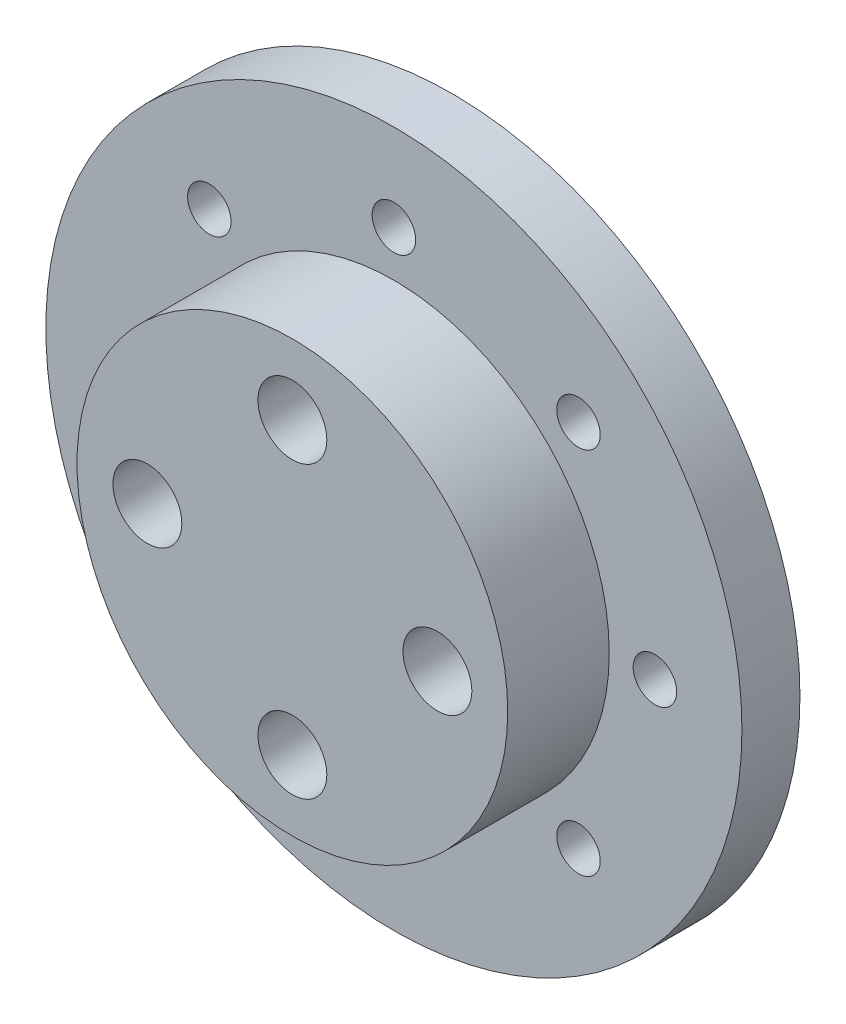
ISO-10303-21;
HEADER;
FILE_DESCRIPTION(('STEP AP214'),'2;1');
FILE_NAME('part.step','',(''),(''),'','','');
FILE_SCHEMA(('AUTOMOTIVE_DESIGN { 1 0 10303 214 1 1 1 1 }'));
ENDSEC;
DATA;
#1=APPLICATION_CONTEXT('core data for automotive mechanical design processes');
#2=APPLICATION_PROTOCOL_DEFINITION('international standard','automotive_design',2000,#1);
#3=PRODUCT_CONTEXT('',#1,'mechanical');
#4=PRODUCT('Part','Part','',(#3));
#5=PRODUCT_RELATED_PRODUCT_CATEGORY('part','',(#4));
#6=PRODUCT_DEFINITION_FORMATION('','',#4);
#7=PRODUCT_DEFINITION_CONTEXT('part definition',#1,'design');
#8=PRODUCT_DEFINITION('design','',#6,#7);
#9=PRODUCT_DEFINITION_SHAPE('','',#8);
#10=(LENGTH_UNIT() NAMED_UNIT(*) SI_UNIT(.MILLI.,.METRE.));
#11=(NAMED_UNIT(*) PLANE_ANGLE_UNIT() SI_UNIT($,.RADIAN.));
#12=(NAMED_UNIT(*) SI_UNIT($,.STERADIAN.) SOLID_ANGLE_UNIT());
#13=UNCERTAINTY_MEASURE_WITH_UNIT(LENGTH_MEASURE(1.E-05),#10,'distance_accuracy_value','');
#14=(GEOMETRIC_REPRESENTATION_CONTEXT(3) GLOBAL_UNCERTAINTY_ASSIGNED_CONTEXT((#13)) GLOBAL_UNIT_ASSIGNED_CONTEXT((#10,
#11,#12)) REPRESENTATION_CONTEXT('',''));
#15=CARTESIAN_POINT('',(0.,0.,0.));
#16=DIRECTION('',(0.,0.,1.));
#17=DIRECTION('',(1.,0.,0.));
#18=AXIS2_PLACEMENT_3D('',#15,#16,#17);
#19=CARTESIAN_POINT('',(0.,0.,4.));
#20=DIRECTION('',(0.,0.,1.));
#21=DIRECTION('',(1.,0.,0.));
#22=AXIS2_PLACEMENT_3D('',#19,#20,#21);
#23=PLANE('',#22);
#24=CARTESIAN_POINT('',(0.,0.,4.));
#25=DIRECTION('',(0.,0.,1.));
#26=DIRECTION('',(1.,0.,0.));
#27=AXIS2_PLACEMENT_3D('',#24,#25,#26);
#28=CIRCLE('',#27,14.85);
#29=CARTESIAN_POINT('',(14.85,0.,4.));
#30=VERTEX_POINT('',#29);
#31=EDGE_CURVE('E106',#30,#30,#28,.T.);
#32=ORIENTED_EDGE('',*,*,#31,.F.);
#33=EDGE_LOOP('',(#32));
#34=FACE_BOUND('',#33,.T.);
#35=CARTESIAN_POINT('',(-18.,1.88539992297529E-13,4.));
#36=DIRECTION('',(0.,0.,1.));
#37=DIRECTION('',(1.,0.,0.));
#38=AXIS2_PLACEMENT_3D('',#35,#36,#37);
#39=CIRCLE('',#38,1.5);
#40=CARTESIAN_POINT('',(-16.5,1.88539992297529E-13,4.));
#41=VERTEX_POINT('',#40);
#42=EDGE_CURVE('E88',#41,#41,#39,.T.);
#43=ORIENTED_EDGE('',*,*,#42,.F.);
#44=EDGE_LOOP('',(#43));
#45=FACE_BOUND('',#44,.T.);
#46=CARTESIAN_POINT('',(-1.25693328198353E-13,-18.,4.));
#47=DIRECTION('',(0.,0.,1.));
#48=DIRECTION('',(1.,0.,0.));
#49=AXIS2_PLACEMENT_3D('',#46,#47,#48);
#50=CIRCLE('',#49,1.5);
#51=CARTESIAN_POINT('',(1.49999999999987,-18.,4.));
#52=VERTEX_POINT('',#51);
#53=EDGE_CURVE('E76',#52,#52,#50,.T.);
#54=ORIENTED_EDGE('',*,*,#53,.F.);
#55=EDGE_LOOP('',(#54));
#56=FACE_BOUND('',#55,.T.);
#57=CARTESIAN_POINT('',(18.,0.,4.));
#58=DIRECTION('',(0.,0.,1.));
#59=DIRECTION('',(1.,0.,0.));
#60=AXIS2_PLACEMENT_3D('',#57,#58,#59);
#61=CIRCLE('',#60,1.5);
#62=CARTESIAN_POINT('',(19.5,0.,4.));
#63=VERTEX_POINT('',#62);
#64=EDGE_CURVE('E64',#63,#63,#61,.T.);
#65=ORIENTED_EDGE('',*,*,#64,.F.);
#66=EDGE_LOOP('',(#65));
#67=FACE_BOUND('',#66,.T.);
#68=CARTESIAN_POINT('',(0.,0.,4.));
#69=DIRECTION('',(0.,0.,1.));
#70=DIRECTION('',(1.,0.,0.));
#71=AXIS2_PLACEMENT_3D('',#68,#69,#70);
#72=CIRCLE('',#71,24.);
#73=CARTESIAN_POINT('',(24.,0.,4.));
#74=VERTEX_POINT('',#73);
#75=EDGE_CURVE('E10',#74,#74,#72,.T.);
#76=ORIENTED_EDGE('',*,*,#75,.T.);
#77=EDGE_LOOP('',(#76));
#78=FACE_BOUND('',#77,.T.);
#79=CARTESIAN_POINT('',(0.,18.,4.));
#80=DIRECTION('',(0.,0.,1.));
#81=DIRECTION('',(1.,0.,0.));
#82=AXIS2_PLACEMENT_3D('',#79,#80,#81);
#83=CIRCLE('',#82,1.5);
#84=CARTESIAN_POINT('',(1.5,18.,4.));
#85=VERTEX_POINT('',#84);
#86=EDGE_CURVE('E50',#85,#85,#83,.T.);
#87=ORIENTED_EDGE('',*,*,#86,.F.);
#88=EDGE_LOOP('',(#87));
#89=FACE_BOUND('',#88,.T.);
#90=CARTESIAN_POINT('',(12.7279220613579,12.7279220613578,4.));
#91=DIRECTION('',(0.,0.,1.));
#92=DIRECTION('',(1.,0.,0.));
#93=AXIS2_PLACEMENT_3D('',#90,#91,#92);
#94=CIRCLE('',#93,1.5);
#95=CARTESIAN_POINT('',(14.2279220613579,12.7279220613578,4.));
#96=VERTEX_POINT('',#95);
#97=EDGE_CURVE('E60',#96,#96,#94,.T.);
#98=ORIENTED_EDGE('',*,*,#97,.F.);
#99=EDGE_LOOP('',(#98));
#100=FACE_BOUND('',#99,.T.);
#101=CARTESIAN_POINT('',(12.7279220613578,-12.7279220613579,4.));
#102=DIRECTION('',(0.,0.,1.));
#103=DIRECTION('',(1.,0.,0.));
#104=AXIS2_PLACEMENT_3D('',#101,#102,#103);
#105=CIRCLE('',#104,1.5);
#106=CARTESIAN_POINT('',(14.2279220613578,-12.7279220613579,4.));
#107=VERTEX_POINT('',#106);
#108=EDGE_CURVE('E70',#107,#107,#105,.T.);
#109=ORIENTED_EDGE('',*,*,#108,.F.);
#110=EDGE_LOOP('',(#109));
#111=FACE_BOUND('',#110,.T.);
#112=CARTESIAN_POINT('',(-12.727922061358,-12.7279220613577,4.));
#113=DIRECTION('',(0.,0.,1.));
#114=DIRECTION('',(1.,0.,0.));
#115=AXIS2_PLACEMENT_3D('',#112,#113,#114);
#116=CIRCLE('',#115,1.5);
#117=CARTESIAN_POINT('',(-11.227922061358,-12.7279220613577,4.));
#118=VERTEX_POINT('',#117);
#119=EDGE_CURVE('E82',#118,#118,#116,.T.);
#120=ORIENTED_EDGE('',*,*,#119,.F.);
#121=EDGE_LOOP('',(#120));
#122=FACE_BOUND('',#121,.T.);
#123=CARTESIAN_POINT('',(-12.7279220613577,12.727922061358,4.));
#124=DIRECTION('',(0.,0.,1.));
#125=DIRECTION('',(1.,0.,0.));
#126=AXIS2_PLACEMENT_3D('',#123,#124,#125);
#127=CIRCLE('',#126,1.5);
#128=CARTESIAN_POINT('',(-11.2279220613577,12.727922061358,4.));
#129=VERTEX_POINT('',#128);
#130=EDGE_CURVE('E94',#129,#129,#127,.T.);
#131=ORIENTED_EDGE('',*,*,#130,.F.);
#132=EDGE_LOOP('',(#131));
#133=FACE_BOUND('',#132,.T.);
#134=ADVANCED_FACE('F39',(#34,#45,#56,#67,#78,#89,#100,#111,#122,#133),#23,.T.);
#135=CARTESIAN_POINT('',(0.,0.,0.));
#136=DIRECTION('',(0.,0.,1.));
#137=DIRECTION('',(1.,0.,0.));
#138=AXIS2_PLACEMENT_3D('',#135,#136,#137);
#139=PLANE('',#138);
#140=CARTESIAN_POINT('',(0.,0.,0.));
#141=DIRECTION('',(0.,0.,1.));
#142=DIRECTION('',(1.,0.,0.));
#143=AXIS2_PLACEMENT_3D('',#140,#141,#142);
#144=CIRCLE('',#143,24.);
#145=CARTESIAN_POINT('',(24.,0.,0.));
#146=VERTEX_POINT('',#145);
#147=EDGE_CURVE('E43',#146,#146,#144,.T.);
#148=ORIENTED_EDGE('',*,*,#147,.F.);
#149=EDGE_LOOP('',(#148));
#150=FACE_BOUND('',#149,.T.);
#151=CARTESIAN_POINT('',(0.,18.,0.));
#152=DIRECTION('',(0.,0.,1.));
#153=DIRECTION('',(1.,0.,0.));
#154=AXIS2_PLACEMENT_3D('',#151,#152,#153);
#155=CIRCLE('',#154,1.5);
#156=CARTESIAN_POINT('',(1.5,18.,0.));
#157=VERTEX_POINT('',#156);
#158=EDGE_CURVE('E52',#157,#157,#155,.T.);
#159=ORIENTED_EDGE('',*,*,#158,.T.);
#160=EDGE_LOOP('',(#159));
#161=FACE_BOUND('',#160,.T.);
#162=CARTESIAN_POINT('',(0.,0.,0.));
#163=DIRECTION('',(0.,0.,1.));
#164=DIRECTION('',(1.,0.,0.));
#165=AXIS2_PLACEMENT_3D('',#162,#163,#164);
#166=CIRCLE('',#165,3.);
#167=CARTESIAN_POINT('',(3.,0.,0.));
#168=VERTEX_POINT('',#167);
#169=EDGE_CURVE('E55',#168,#168,#166,.T.);
#170=ORIENTED_EDGE('',*,*,#169,.T.);
#171=EDGE_LOOP('',(#170));
#172=FACE_BOUND('',#171,.T.);
#173=CARTESIAN_POINT('',(12.7279220613579,12.7279220613578,0.));
#174=DIRECTION('',(0.,0.,1.));
#175=DIRECTION('',(1.,0.,0.));
#176=AXIS2_PLACEMENT_3D('',#173,#174,#175);
#177=CIRCLE('',#176,1.5);
#178=CARTESIAN_POINT('',(14.2279220613579,12.7279220613578,0.));
#179=VERTEX_POINT('',#178);
#180=EDGE_CURVE('E61',#179,#179,#177,.T.);
#181=ORIENTED_EDGE('',*,*,#180,.T.);
#182=EDGE_LOOP('',(#181));
#183=FACE_BOUND('',#182,.T.);
#184=CARTESIAN_POINT('',(18.,0.,0.));
#185=DIRECTION('',(0.,0.,1.));
#186=DIRECTION('',(1.,0.,0.));
#187=AXIS2_PLACEMENT_3D('',#184,#185,#186);
#188=CIRCLE('',#187,1.5);
#189=CARTESIAN_POINT('',(19.5,0.,0.));
#190=VERTEX_POINT('',#189);
#191=EDGE_CURVE('E67',#190,#190,#188,.T.);
#192=ORIENTED_EDGE('',*,*,#191,.T.);
#193=EDGE_LOOP('',(#192));
#194=FACE_BOUND('',#193,.T.);
#195=CARTESIAN_POINT('',(12.7279220613578,-12.7279220613579,0.));
#196=DIRECTION('',(0.,0.,1.));
#197=DIRECTION('',(1.,0.,0.));
#198=AXIS2_PLACEMENT_3D('',#195,#196,#197);
#199=CIRCLE('',#198,1.5);
#200=CARTESIAN_POINT('',(14.2279220613578,-12.7279220613579,0.));
#201=VERTEX_POINT('',#200);
#202=EDGE_CURVE('E73',#201,#201,#199,.T.);
#203=ORIENTED_EDGE('',*,*,#202,.T.);
#204=EDGE_LOOP('',(#203));
#205=FACE_BOUND('',#204,.T.);
#206=CARTESIAN_POINT('',(-1.25693328198353E-13,-18.,0.));
#207=DIRECTION('',(0.,0.,1.));
#208=DIRECTION('',(1.,0.,0.));
#209=AXIS2_PLACEMENT_3D('',#206,#207,#208);
#210=CIRCLE('',#209,1.5);
#211=CARTESIAN_POINT('',(1.49999999999987,-18.,0.));
#212=VERTEX_POINT('',#211);
#213=EDGE_CURVE('E79',#212,#212,#210,.T.);
#214=ORIENTED_EDGE('',*,*,#213,.T.);
#215=EDGE_LOOP('',(#214));
#216=FACE_BOUND('',#215,.T.);
#217=CARTESIAN_POINT('',(-12.727922061358,-12.7279220613577,0.));
#218=DIRECTION('',(0.,0.,1.));
#219=DIRECTION('',(1.,0.,0.));
#220=AXIS2_PLACEMENT_3D('',#217,#218,#219);
#221=CIRCLE('',#220,1.5);
#222=CARTESIAN_POINT('',(-11.227922061358,-12.7279220613577,0.));
#223=VERTEX_POINT('',#222);
#224=EDGE_CURVE('E85',#223,#223,#221,.T.);
#225=ORIENTED_EDGE('',*,*,#224,.T.);
#226=EDGE_LOOP('',(#225));
#227=FACE_BOUND('',#226,.T.);
#228=CARTESIAN_POINT('',(-18.,1.88539992297529E-13,0.));
#229=DIRECTION('',(0.,0.,1.));
#230=DIRECTION('',(1.,0.,0.));
#231=AXIS2_PLACEMENT_3D('',#228,#229,#230);
#232=CIRCLE('',#231,1.5);
#233=CARTESIAN_POINT('',(-16.5,1.88539992297529E-13,0.));
#234=VERTEX_POINT('',#233);
#235=EDGE_CURVE('E91',#234,#234,#232,.T.);
#236=ORIENTED_EDGE('',*,*,#235,.T.);
#237=EDGE_LOOP('',(#236));
#238=FACE_BOUND('',#237,.T.);
#239=CARTESIAN_POINT('',(-12.7279220613577,12.727922061358,0.));
#240=DIRECTION('',(0.,0.,1.));
#241=DIRECTION('',(1.,0.,0.));
#242=AXIS2_PLACEMENT_3D('',#239,#240,#241);
#243=CIRCLE('',#242,1.5);
#244=CARTESIAN_POINT('',(-11.2279220613577,12.727922061358,0.));
#245=VERTEX_POINT('',#244);
#246=EDGE_CURVE('E97',#245,#245,#243,.T.);
#247=ORIENTED_EDGE('',*,*,#246,.T.);
#248=EDGE_LOOP('',(#247));
#249=FACE_BOUND('',#248,.T.);
#250=ADVANCED_FACE('F167',(#150,#161,#172,#183,#194,#205,#216,#227,#238,#249),#139,.F.);
#251=CARTESIAN_POINT('',(0.,0.,4.));
#252=DIRECTION('',(0.,0.,-1.));
#253=DIRECTION('',(-1.,0.,0.));
#254=AXIS2_PLACEMENT_3D('',#251,#252,#253);
#255=CYLINDRICAL_SURFACE('',#254,24.);
#256=ORIENTED_EDGE('',*,*,#75,.F.);
#257=EDGE_LOOP('',(#256));
#258=FACE_BOUND('',#257,.T.);
#259=ORIENTED_EDGE('',*,*,#147,.T.);
#260=EDGE_LOOP('',(#259));
#261=FACE_BOUND('',#260,.T.);
#262=ADVANCED_FACE('F41',(#258,#261),#255,.T.);
#263=CARTESIAN_POINT('',(0.,18.,4.));
#264=DIRECTION('',(0.,0.,-1.));
#265=DIRECTION('',(-1.,0.,0.));
#266=AXIS2_PLACEMENT_3D('',#263,#264,#265);
#267=CYLINDRICAL_SURFACE('',#266,1.5);
#268=ORIENTED_EDGE('',*,*,#86,.T.);
#269=EDGE_LOOP('',(#268));
#270=FACE_BOUND('',#269,.T.);
#271=ORIENTED_EDGE('',*,*,#158,.F.);
#272=EDGE_LOOP('',(#271));
#273=FACE_BOUND('',#272,.T.);
#274=ADVANCED_FACE('F197',(#270,#273),#267,.F.);
#275=CARTESIAN_POINT('',(0.,0.,4.));
#276=DIRECTION('',(0.,0.,-1.));
#277=DIRECTION('',(-1.,0.,0.));
#278=AXIS2_PLACEMENT_3D('',#275,#276,#277);
#279=CYLINDRICAL_SURFACE('',#278,3.);
#280=CARTESIAN_POINT('',(0.,0.,4.));
#281=DIRECTION('',(0.,0.,1.));
#282=DIRECTION('',(1.,0.,0.));
#283=AXIS2_PLACEMENT_3D('',#280,#281,#282);
#284=CIRCLE('',#283,3.);
#285=CARTESIAN_POINT('',(3.,0.,4.));
#286=VERTEX_POINT('',#285);
#287=EDGE_CURVE('E100',#286,#286,#284,.T.);
#288=ORIENTED_EDGE('',*,*,#287,.T.);
#289=EDGE_LOOP('',(#288));
#290=FACE_BOUND('',#289,.T.);
#291=ORIENTED_EDGE('',*,*,#169,.F.);
#292=EDGE_LOOP('',(#291));
#293=FACE_BOUND('',#292,.T.);
#294=ADVANCED_FACE('F204',(#290,#293),#279,.F.);
#295=CARTESIAN_POINT('',(12.7279220613579,12.7279220613578,4.));
#296=DIRECTION('',(0.,0.,-1.));
#297=DIRECTION('',(-1.,0.,0.));
#298=AXIS2_PLACEMENT_3D('',#295,#296,#297);
#299=CYLINDRICAL_SURFACE('',#298,1.5);
#300=ORIENTED_EDGE('',*,*,#97,.T.);
#301=EDGE_LOOP('',(#300));
#302=FACE_BOUND('',#301,.T.);
#303=ORIENTED_EDGE('',*,*,#180,.F.);
#304=EDGE_LOOP('',(#303));
#305=FACE_BOUND('',#304,.T.);
#306=ADVANCED_FACE('F208',(#302,#305),#299,.F.);
#307=CARTESIAN_POINT('',(18.,0.,4.));
#308=DIRECTION('',(0.,0.,-1.));
#309=DIRECTION('',(-1.,0.,0.));
#310=AXIS2_PLACEMENT_3D('',#307,#308,#309);
#311=CYLINDRICAL_SURFACE('',#310,1.5);
#312=ORIENTED_EDGE('',*,*,#64,.T.);
#313=EDGE_LOOP('',(#312));
#314=FACE_BOUND('',#313,.T.);
#315=ORIENTED_EDGE('',*,*,#191,.F.);
#316=EDGE_LOOP('',(#315));
#317=FACE_BOUND('',#316,.T.);
#318=ADVANCED_FACE('F212',(#314,#317),#311,.F.);
#319=CARTESIAN_POINT('',(12.7279220613578,-12.7279220613579,4.));
#320=DIRECTION('',(0.,0.,-1.));
#321=DIRECTION('',(-1.,0.,0.));
#322=AXIS2_PLACEMENT_3D('',#319,#320,#321);
#323=CYLINDRICAL_SURFACE('',#322,1.5);
#324=ORIENTED_EDGE('',*,*,#108,.T.);
#325=EDGE_LOOP('',(#324));
#326=FACE_BOUND('',#325,.T.);
#327=ORIENTED_EDGE('',*,*,#202,.F.);
#328=EDGE_LOOP('',(#327));
#329=FACE_BOUND('',#328,.T.);
#330=ADVANCED_FACE('F216',(#326,#329),#323,.F.);
#331=CARTESIAN_POINT('',(-1.25693328198353E-13,-18.,4.));
#332=DIRECTION('',(0.,0.,-1.));
#333=DIRECTION('',(-1.,0.,0.));
#334=AXIS2_PLACEMENT_3D('',#331,#332,#333);
#335=CYLINDRICAL_SURFACE('',#334,1.5);
#336=ORIENTED_EDGE('',*,*,#53,.T.);
#337=EDGE_LOOP('',(#336));
#338=FACE_BOUND('',#337,.T.);
#339=ORIENTED_EDGE('',*,*,#213,.F.);
#340=EDGE_LOOP('',(#339));
#341=FACE_BOUND('',#340,.T.);
#342=ADVANCED_FACE('F220',(#338,#341),#335,.F.);
#343=CARTESIAN_POINT('',(-12.727922061358,-12.7279220613577,4.));
#344=DIRECTION('',(0.,0.,-1.));
#345=DIRECTION('',(-1.,0.,0.));
#346=AXIS2_PLACEMENT_3D('',#343,#344,#345);
#347=CYLINDRICAL_SURFACE('',#346,1.5);
#348=ORIENTED_EDGE('',*,*,#119,.T.);
#349=EDGE_LOOP('',(#348));
#350=FACE_BOUND('',#349,.T.);
#351=ORIENTED_EDGE('',*,*,#224,.F.);
#352=EDGE_LOOP('',(#351));
#353=FACE_BOUND('',#352,.T.);
#354=ADVANCED_FACE('F224',(#350,#353),#347,.F.);
#355=CARTESIAN_POINT('',(-18.,1.88539992297529E-13,4.));
#356=DIRECTION('',(0.,0.,-1.));
#357=DIRECTION('',(-1.,0.,0.));
#358=AXIS2_PLACEMENT_3D('',#355,#356,#357);
#359=CYLINDRICAL_SURFACE('',#358,1.5);
#360=ORIENTED_EDGE('',*,*,#42,.T.);
#361=EDGE_LOOP('',(#360));
#362=FACE_BOUND('',#361,.T.);
#363=ORIENTED_EDGE('',*,*,#235,.F.);
#364=EDGE_LOOP('',(#363));
#365=FACE_BOUND('',#364,.T.);
#366=ADVANCED_FACE('F188',(#362,#365),#359,.F.);
#367=CARTESIAN_POINT('',(-12.7279220613577,12.727922061358,4.));
#368=DIRECTION('',(0.,0.,-1.));
#369=DIRECTION('',(-1.,0.,0.));
#370=AXIS2_PLACEMENT_3D('',#367,#368,#369);
#371=CYLINDRICAL_SURFACE('',#370,1.5);
#372=ORIENTED_EDGE('',*,*,#130,.T.);
#373=EDGE_LOOP('',(#372));
#374=FACE_BOUND('',#373,.T.);
#375=ORIENTED_EDGE('',*,*,#246,.F.);
#376=EDGE_LOOP('',(#375));
#377=FACE_BOUND('',#376,.T.);
#378=ADVANCED_FACE('F185',(#374,#377),#371,.F.);
#379=CARTESIAN_POINT('',(0.,0.,4.));
#380=DIRECTION('',(0.,0.,1.));
#381=DIRECTION('',(1.,0.,0.));
#382=AXIS2_PLACEMENT_3D('',#379,#380,#381);
#383=PLANE('',#382);
#384=ORIENTED_EDGE('',*,*,#287,.F.);
#385=EDGE_LOOP('',(#384));
#386=FACE_BOUND('',#385,.T.);
#387=ADVANCED_FACE('F161',(#386),#383,.F.);
#388=CARTESIAN_POINT('',(0.,0.,11.));
#389=DIRECTION('',(0.,0.,-1.));
#390=DIRECTION('',(-1.,0.,0.));
#391=AXIS2_PLACEMENT_3D('',#388,#389,#390);
#392=CYLINDRICAL_SURFACE('',#391,14.85);
#393=CARTESIAN_POINT('',(0.,0.,11.));
#394=DIRECTION('',(0.,0.,1.));
#395=DIRECTION('',(1.,0.,0.));
#396=AXIS2_PLACEMENT_3D('',#393,#394,#395);
#397=CIRCLE('',#396,14.85);
#398=CARTESIAN_POINT('',(14.85,0.,11.));
#399=VERTEX_POINT('',#398);
#400=EDGE_CURVE('E105',#399,#399,#397,.T.);
#401=ORIENTED_EDGE('',*,*,#400,.F.);
#402=EDGE_LOOP('',(#401));
#403=FACE_BOUND('',#402,.T.);
#404=ORIENTED_EDGE('',*,*,#31,.T.);
#405=EDGE_LOOP('',(#404));
#406=FACE_BOUND('',#405,.T.);
#407=ADVANCED_FACE('F149',(#403,#406),#392,.T.);
#408=CARTESIAN_POINT('',(0.,0.,11.));
#409=DIRECTION('',(0.,0.,1.));
#410=DIRECTION('',(1.,0.,0.));
#411=AXIS2_PLACEMENT_3D('',#408,#409,#410);
#412=PLANE('',#411);
#413=CARTESIAN_POINT('',(0.,10.,11.));
#414=DIRECTION('',(0.,0.,1.));
#415=DIRECTION('',(1.,0.,0.));
#416=AXIS2_PLACEMENT_3D('',#413,#414,#415);
#417=CIRCLE('',#416,2.375);
#418=CARTESIAN_POINT('',(2.375,10.,11.));
#419=VERTEX_POINT('',#418);
#420=EDGE_CURVE('E130',#419,#419,#417,.T.);
#421=ORIENTED_EDGE('',*,*,#420,.F.);
#422=EDGE_LOOP('',(#421));
#423=FACE_BOUND('',#422,.T.);
#424=CARTESIAN_POINT('',(10.,0.,11.));
#425=DIRECTION('',(0.,0.,1.));
#426=DIRECTION('',(1.,0.,0.));
#427=AXIS2_PLACEMENT_3D('',#424,#425,#426);
#428=CIRCLE('',#427,2.375);
#429=CARTESIAN_POINT('',(12.375,0.,11.));
#430=VERTEX_POINT('',#429);
#431=EDGE_CURVE('E127',#430,#430,#428,.T.);
#432=ORIENTED_EDGE('',*,*,#431,.F.);
#433=EDGE_LOOP('',(#432));
#434=FACE_BOUND('',#433,.T.);
#435=CARTESIAN_POINT('',(0.,-10.,11.));
#436=DIRECTION('',(0.,0.,1.));
#437=DIRECTION('',(1.,0.,0.));
#438=AXIS2_PLACEMENT_3D('',#435,#436,#437);
#439=CIRCLE('',#438,2.375);
#440=CARTESIAN_POINT('',(2.375,-10.,11.));
#441=VERTEX_POINT('',#440);
#442=EDGE_CURVE('E121',#441,#441,#439,.T.);
#443=ORIENTED_EDGE('',*,*,#442,.F.);
#444=EDGE_LOOP('',(#443));
#445=FACE_BOUND('',#444,.T.);
#446=CARTESIAN_POINT('',(-10.,0.,11.));
#447=DIRECTION('',(0.,0.,1.));
#448=DIRECTION('',(1.,0.,0.));
#449=AXIS2_PLACEMENT_3D('',#446,#447,#448);
#450=CIRCLE('',#449,2.375);
#451=CARTESIAN_POINT('',(-7.625,0.,11.));
#452=VERTEX_POINT('',#451);
#453=EDGE_CURVE('E115',#452,#452,#450,.T.);
#454=ORIENTED_EDGE('',*,*,#453,.F.);
#455=EDGE_LOOP('',(#454));
#456=FACE_BOUND('',#455,.T.);
#457=ORIENTED_EDGE('',*,*,#400,.T.);
#458=EDGE_LOOP('',(#457));
#459=FACE_BOUND('',#458,.T.);
#460=ADVANCED_FACE('F145',(#423,#434,#445,#456,#459),#412,.T.);
#461=CARTESIAN_POINT('',(-10.,0.,0.999999999999999));
#462=DIRECTION('',(0.,0.,1.));
#463=DIRECTION('',(1.,0.,0.));
#464=AXIS2_PLACEMENT_3D('',#461,#462,#463);
#465=CYLINDRICAL_SURFACE('',#464,2.375);
#466=CARTESIAN_POINT('',(-10.,0.,0.999999999999999));
#467=DIRECTION('',(0.,0.,1.));
#468=DIRECTION('',(1.,0.,0.));
#469=AXIS2_PLACEMENT_3D('',#466,#467,#468);
#470=CIRCLE('',#469,2.375);
#471=CARTESIAN_POINT('',(-7.625,0.,0.999999999999999));
#472=VERTEX_POINT('',#471);
#473=EDGE_CURVE('E112',#472,#472,#470,.T.);
#474=ORIENTED_EDGE('',*,*,#473,.F.);
#475=EDGE_LOOP('',(#474));
#476=FACE_BOUND('',#475,.T.);
#477=ORIENTED_EDGE('',*,*,#453,.T.);
#478=EDGE_LOOP('',(#477));
#479=FACE_BOUND('',#478,.T.);
#480=ADVANCED_FACE('F148',(#476,#479),#465,.F.);
#481=CARTESIAN_POINT('',(-10.,0.,0.999999999999999));
#482=DIRECTION('',(0.,0.,1.));
#483=DIRECTION('',(1.,0.,0.));
#484=AXIS2_PLACEMENT_3D('',#481,#482,#483);
#485=PLANE('',#484);
#486=ORIENTED_EDGE('',*,*,#473,.T.);
#487=EDGE_LOOP('',(#486));
#488=FACE_BOUND('',#487,.T.);
#489=ADVANCED_FACE('F235',(#488),#485,.T.);
#490=CARTESIAN_POINT('',(0.,-10.,0.999999999999999));
#491=DIRECTION('',(0.,0.,1.));
#492=DIRECTION('',(1.,0.,0.));
#493=AXIS2_PLACEMENT_3D('',#490,#491,#492);
#494=CYLINDRICAL_SURFACE('',#493,2.375);
#495=CARTESIAN_POINT('',(0.,-10.,0.999999999999999));
#496=DIRECTION('',(0.,0.,1.));
#497=DIRECTION('',(1.,0.,0.));
#498=AXIS2_PLACEMENT_3D('',#495,#496,#497);
#499=CIRCLE('',#498,2.375);
#500=CARTESIAN_POINT('',(2.375,-10.,0.999999999999999));
#501=VERTEX_POINT('',#500);
#502=EDGE_CURVE('E118',#501,#501,#499,.T.);
#503=ORIENTED_EDGE('',*,*,#502,.F.);
#504=EDGE_LOOP('',(#503));
#505=FACE_BOUND('',#504,.T.);
#506=ORIENTED_EDGE('',*,*,#442,.T.);
#507=EDGE_LOOP('',(#506));
#508=FACE_BOUND('',#507,.T.);
#509=ADVANCED_FACE('F238',(#505,#508),#494,.F.);
#510=CARTESIAN_POINT('',(0.,-10.,0.999999999999999));
#511=DIRECTION('',(0.,0.,1.));
#512=DIRECTION('',(1.,0.,0.));
#513=AXIS2_PLACEMENT_3D('',#510,#511,#512);
#514=PLANE('',#513);
#515=ORIENTED_EDGE('',*,*,#502,.T.);
#516=EDGE_LOOP('',(#515));
#517=FACE_BOUND('',#516,.T.);
#518=ADVANCED_FACE('F243',(#517),#514,.T.);
#519=CARTESIAN_POINT('',(10.,0.,0.999999999999999));
#520=DIRECTION('',(0.,0.,1.));
#521=DIRECTION('',(1.,0.,0.));
#522=AXIS2_PLACEMENT_3D('',#519,#520,#521);
#523=CYLINDRICAL_SURFACE('',#522,2.375);
#524=CARTESIAN_POINT('',(10.,0.,0.999999999999999));
#525=DIRECTION('',(0.,0.,1.));
#526=DIRECTION('',(1.,0.,0.));
#527=AXIS2_PLACEMENT_3D('',#524,#525,#526);
#528=CIRCLE('',#527,2.375);
#529=CARTESIAN_POINT('',(12.375,0.,0.999999999999999));
#530=VERTEX_POINT('',#529);
#531=EDGE_CURVE('E124',#530,#530,#528,.T.);
#532=ORIENTED_EDGE('',*,*,#531,.F.);
#533=EDGE_LOOP('',(#532));
#534=FACE_BOUND('',#533,.T.);
#535=ORIENTED_EDGE('',*,*,#431,.T.);
#536=EDGE_LOOP('',(#535));
#537=FACE_BOUND('',#536,.T.);
#538=ADVANCED_FACE('F246',(#534,#537),#523,.F.);
#539=CARTESIAN_POINT('',(10.,0.,0.999999999999999));
#540=DIRECTION('',(0.,0.,1.));
#541=DIRECTION('',(1.,0.,0.));
#542=AXIS2_PLACEMENT_3D('',#539,#540,#541);
#543=PLANE('',#542);
#544=ORIENTED_EDGE('',*,*,#531,.T.);
#545=EDGE_LOOP('',(#544));
#546=FACE_BOUND('',#545,.T.);
#547=ADVANCED_FACE('F141',(#546),#543,.T.);
#548=CARTESIAN_POINT('',(0.,10.,0.999999999999999));
#549=DIRECTION('',(0.,0.,1.));
#550=DIRECTION('',(1.,0.,0.));
#551=AXIS2_PLACEMENT_3D('',#548,#549,#550);
#552=CYLINDRICAL_SURFACE('',#551,2.375);
#553=CARTESIAN_POINT('',(0.,10.,0.999999999999999));
#554=DIRECTION('',(0.,0.,1.));
#555=DIRECTION('',(1.,0.,0.));
#556=AXIS2_PLACEMENT_3D('',#553,#554,#555);
#557=CIRCLE('',#556,2.375);
#558=CARTESIAN_POINT('',(2.375,10.,0.999999999999999));
#559=VERTEX_POINT('',#558);
#560=EDGE_CURVE('E109',#559,#559,#557,.T.);
#561=ORIENTED_EDGE('',*,*,#560,.F.);
#562=EDGE_LOOP('',(#561));
#563=FACE_BOUND('',#562,.T.);
#564=ORIENTED_EDGE('',*,*,#420,.T.);
#565=EDGE_LOOP('',(#564));
#566=FACE_BOUND('',#565,.T.);
#567=ADVANCED_FACE('F138',(#563,#566),#552,.F.);
#568=CARTESIAN_POINT('',(0.,10.,0.999999999999999));
#569=DIRECTION('',(0.,0.,1.));
#570=DIRECTION('',(1.,0.,0.));
#571=AXIS2_PLACEMENT_3D('',#568,#569,#570);
#572=PLANE('',#571);
#573=ORIENTED_EDGE('',*,*,#560,.T.);
#574=EDGE_LOOP('',(#573));
#575=FACE_BOUND('',#574,.T.);
#576=ADVANCED_FACE('F136',(#575),#572,.T.);
#577=CLOSED_SHELL('',(#134,#250,#262,#274,#294,#306,#318,#330,#342,#354,#366,#378,#387,#407,
#460,#480,#489,#509,#518,#538,#547,#567,#576));
#578=MANIFOLD_SOLID_BREP('B2',#577);
#579=ADVANCED_BREP_SHAPE_REPRESENTATION('',(#18,#578),#14);
#580=SHAPE_DEFINITION_REPRESENTATION(#9,#579);
ENDSEC;
END-ISO-10303-21;
